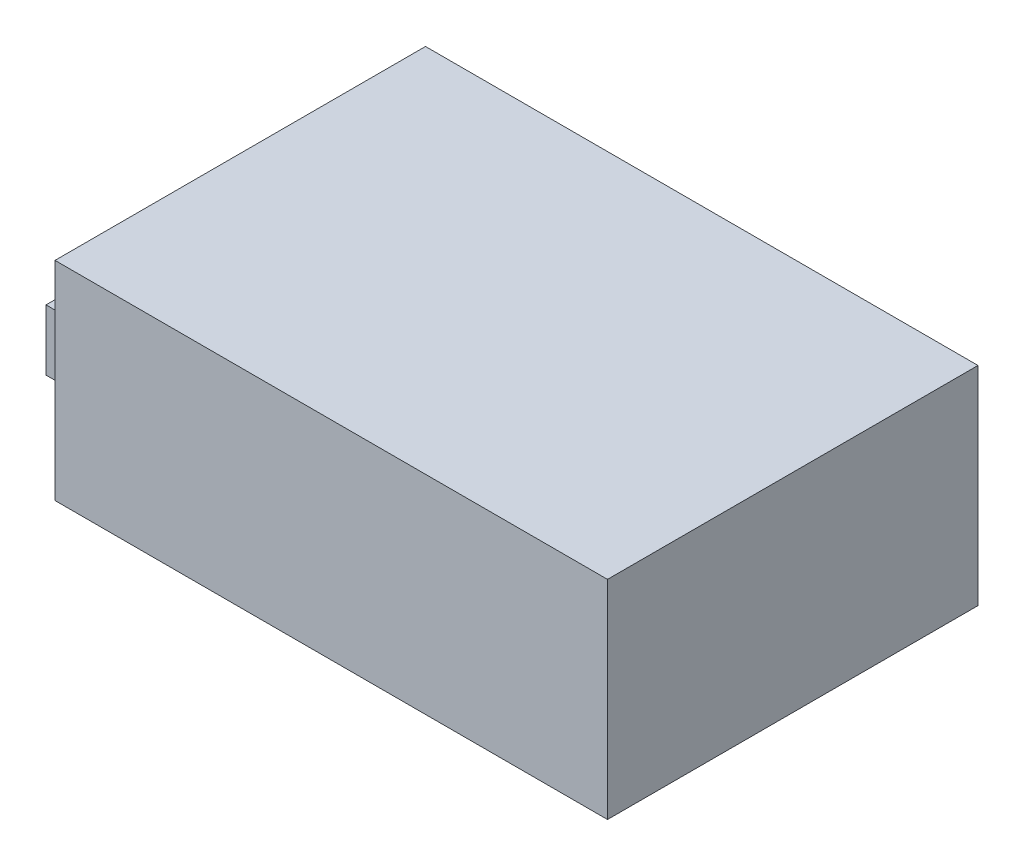
ISO-10303-21;
HEADER;
FILE_DESCRIPTION(('STEP AP214'),'2;1');
FILE_NAME('part.step','',(''),(''),'','','');
FILE_SCHEMA(('AUTOMOTIVE_DESIGN { 1 0 10303 214 1 1 1 1 }'));
ENDSEC;
DATA;
#1=APPLICATION_CONTEXT('core data for automotive mechanical design processes');
#2=APPLICATION_PROTOCOL_DEFINITION('international standard','automotive_design',2000,#1);
#3=PRODUCT_CONTEXT('',#1,'mechanical');
#4=PRODUCT('Part','Part','',(#3));
#5=PRODUCT_RELATED_PRODUCT_CATEGORY('part','',(#4));
#6=PRODUCT_DEFINITION_FORMATION('','',#4);
#7=PRODUCT_DEFINITION_CONTEXT('part definition',#1,'design');
#8=PRODUCT_DEFINITION('design','',#6,#7);
#9=PRODUCT_DEFINITION_SHAPE('','',#8);
#10=(LENGTH_UNIT() NAMED_UNIT(*) SI_UNIT(.MILLI.,.METRE.));
#11=(NAMED_UNIT(*) PLANE_ANGLE_UNIT() SI_UNIT($,.RADIAN.));
#12=(NAMED_UNIT(*) SI_UNIT($,.STERADIAN.) SOLID_ANGLE_UNIT());
#13=UNCERTAINTY_MEASURE_WITH_UNIT(LENGTH_MEASURE(1.E-05),#10,'distance_accuracy_value','');
#14=(GEOMETRIC_REPRESENTATION_CONTEXT(3) GLOBAL_UNCERTAINTY_ASSIGNED_CONTEXT((#13)) GLOBAL_UNIT_ASSIGNED_CONTEXT((#10,
#11,#12)) REPRESENTATION_CONTEXT('',''));
#15=CARTESIAN_POINT('',(0.,0.,0.));
#16=DIRECTION('',(0.,0.,1.));
#17=DIRECTION('',(1.,0.,0.));
#18=AXIS2_PLACEMENT_3D('',#15,#16,#17);
#19=CARTESIAN_POINT('',(-42.5,32.,28.5));
#20=DIRECTION('',(1.,0.,0.));
#21=DIRECTION('',(0.,0.,-1.));
#22=AXIS2_PLACEMENT_3D('',#19,#20,#21);
#23=PLANE('',#22);
#24=DIRECTION('',(0.,0.,1.));
#25=VECTOR('',#24,1.);
#26=CARTESIAN_POINT('',(-42.5,0.,28.5));
#27=LINE('',#26,#25);
#28=CARTESIAN_POINT('',(-42.5,0.,-28.5));
#29=VERTEX_POINT('',#28);
#30=CARTESIAN_POINT('',(-42.5,0.,28.5));
#31=VERTEX_POINT('',#30);
#32=EDGE_CURVE('E120',#29,#31,#27,.T.);
#33=ORIENTED_EDGE('',*,*,#32,.T.);
#34=DIRECTION('',(0.,-1.,0.));
#35=VECTOR('',#34,1.);
#36=CARTESIAN_POINT('',(-42.5,32.,28.5));
#37=LINE('',#36,#35);
#38=CARTESIAN_POINT('',(-42.5,32.,28.5));
#39=VERTEX_POINT('',#38);
#40=EDGE_CURVE('E11',#39,#31,#37,.T.);
#41=ORIENTED_EDGE('',*,*,#40,.F.);
#42=DIRECTION('',(0.,0.,1.));
#43=VECTOR('',#42,1.);
#44=CARTESIAN_POINT('',(-42.5,32.,28.5));
#45=LINE('',#44,#43);
#46=CARTESIAN_POINT('',(-42.5,32.,-28.5));
#47=VERTEX_POINT('',#46);
#48=EDGE_CURVE('E129',#47,#39,#45,.T.);
#49=ORIENTED_EDGE('',*,*,#48,.F.);
#50=DIRECTION('',(0.,-1.,0.));
#51=VECTOR('',#50,1.);
#52=CARTESIAN_POINT('',(-42.5,32.,-28.5));
#53=LINE('',#52,#51);
#54=EDGE_CURVE('E138',#47,#29,#53,.T.);
#55=ORIENTED_EDGE('',*,*,#54,.T.);
#56=EDGE_LOOP('',(#33,#41,#49,#55));
#57=FACE_BOUND('',#56,.T.);
#58=DIRECTION('',(0.,-1.,0.));
#59=VECTOR('',#58,1.);
#60=CARTESIAN_POINT('',(-42.5,3.40163827483973,-20.6707501637126));
#61=LINE('',#60,#59);
#62=CARTESIAN_POINT('',(-42.5,12.7639627764704,-20.6707501637126));
#63=VERTEX_POINT('',#62);
#64=CARTESIAN_POINT('',(-42.5,3.40163827483973,-20.6707501637126));
#65=VERTEX_POINT('',#64);
#66=EDGE_CURVE('E119',#63,#65,#61,.T.);
#67=ORIENTED_EDGE('',*,*,#66,.F.);
#68=DIRECTION('',(0.,0.,-1.));
#69=VECTOR('',#68,1.);
#70=CARTESIAN_POINT('',(-42.5,12.7639627764704,-20.6707501637126));
#71=LINE('',#70,#69);
#72=CARTESIAN_POINT('',(-42.5,12.7639627764704,15.8843932555756));
#73=VERTEX_POINT('',#72);
#74=EDGE_CURVE('E116',#73,#63,#71,.T.);
#75=ORIENTED_EDGE('',*,*,#74,.F.);
#76=DIRECTION('',(0.,1.,0.));
#77=VECTOR('',#76,1.);
#78=CARTESIAN_POINT('',(-42.5,3.40163827483973,15.8843932555756));
#79=LINE('',#78,#77);
#80=CARTESIAN_POINT('',(-42.5,3.40163827483974,15.8843932555756));
#81=VERTEX_POINT('',#80);
#82=EDGE_CURVE('E54',#81,#73,#79,.T.);
#83=ORIENTED_EDGE('',*,*,#82,.F.);
#84=DIRECTION('',(0.,0.,1.));
#85=VECTOR('',#84,1.);
#86=CARTESIAN_POINT('',(-42.5,3.40163827483973,-20.6707501637126));
#87=LINE('',#86,#85);
#88=EDGE_CURVE('E49',#65,#81,#87,.T.);
#89=ORIENTED_EDGE('',*,*,#88,.F.);
#90=EDGE_LOOP('',(#67,#75,#83,#89));
#91=FACE_BOUND('',#90,.T.);
#92=ADVANCED_FACE('F35',(#57,#91),#23,.F.);
#93=CARTESIAN_POINT('',(42.5,32.,28.5));
#94=DIRECTION('',(0.,0.,-1.));
#95=DIRECTION('',(-1.,0.,0.));
#96=AXIS2_PLACEMENT_3D('',#93,#94,#95);
#97=PLANE('',#96);
#98=DIRECTION('',(1.,0.,0.));
#99=VECTOR('',#98,1.);
#100=CARTESIAN_POINT('',(42.5,0.,28.5));
#101=LINE('',#100,#99);
#102=CARTESIAN_POINT('',(42.5,0.,28.5));
#103=VERTEX_POINT('',#102);
#104=EDGE_CURVE('E123',#31,#103,#101,.T.);
#105=ORIENTED_EDGE('',*,*,#104,.T.);
#106=DIRECTION('',(0.,-1.,0.));
#107=VECTOR('',#106,1.);
#108=CARTESIAN_POINT('',(42.5,32.,28.5));
#109=LINE('',#108,#107);
#110=CARTESIAN_POINT('',(42.5,32.,28.5));
#111=VERTEX_POINT('',#110);
#112=EDGE_CURVE('E42',#111,#103,#109,.T.);
#113=ORIENTED_EDGE('',*,*,#112,.F.);
#114=DIRECTION('',(1.,0.,0.));
#115=VECTOR('',#114,1.);
#116=CARTESIAN_POINT('',(42.5,32.,28.5));
#117=LINE('',#116,#115);
#118=EDGE_CURVE('E132',#39,#111,#117,.T.);
#119=ORIENTED_EDGE('',*,*,#118,.F.);
#120=ORIENTED_EDGE('',*,*,#40,.T.);
#121=EDGE_LOOP('',(#105,#113,#119,#120));
#122=FACE_BOUND('',#121,.T.);
#123=ADVANCED_FACE('F169',(#122),#97,.F.);
#124=CARTESIAN_POINT('',(42.5,32.,28.5));
#125=DIRECTION('',(-1.,0.,0.));
#126=DIRECTION('',(0.,0.,1.));
#127=AXIS2_PLACEMENT_3D('',#124,#125,#126);
#128=PLANE('',#127);
#129=DIRECTION('',(0.,0.,-1.));
#130=VECTOR('',#129,1.);
#131=CARTESIAN_POINT('',(42.5,0.,28.5));
#132=LINE('',#131,#130);
#133=CARTESIAN_POINT('',(42.5,0.,-28.5));
#134=VERTEX_POINT('',#133);
#135=EDGE_CURVE('E141',#103,#134,#132,.T.);
#136=ORIENTED_EDGE('',*,*,#135,.T.);
#137=DIRECTION('',(0.,-1.,0.));
#138=VECTOR('',#137,1.);
#139=CARTESIAN_POINT('',(42.5,32.,-28.5));
#140=LINE('',#139,#138);
#141=CARTESIAN_POINT('',(42.5,32.,-28.5));
#142=VERTEX_POINT('',#141);
#143=EDGE_CURVE('E146',#142,#134,#140,.T.);
#144=ORIENTED_EDGE('',*,*,#143,.F.);
#145=DIRECTION('',(0.,0.,-1.));
#146=VECTOR('',#145,1.);
#147=CARTESIAN_POINT('',(42.5,32.,28.5));
#148=LINE('',#147,#146);
#149=EDGE_CURVE('E135',#111,#142,#148,.T.);
#150=ORIENTED_EDGE('',*,*,#149,.F.);
#151=ORIENTED_EDGE('',*,*,#112,.T.);
#152=EDGE_LOOP('',(#136,#144,#150,#151));
#153=FACE_BOUND('',#152,.T.);
#154=ADVANCED_FACE('F153',(#153),#128,.F.);
#155=CARTESIAN_POINT('',(42.5,32.,-28.5));
#156=DIRECTION('',(0.,0.,1.));
#157=DIRECTION('',(1.,0.,0.));
#158=AXIS2_PLACEMENT_3D('',#155,#156,#157);
#159=PLANE('',#158);
#160=DIRECTION('',(-1.,0.,0.));
#161=VECTOR('',#160,1.);
#162=CARTESIAN_POINT('',(42.5,0.,-28.5));
#163=LINE('',#162,#161);
#164=EDGE_CURVE('E133',#134,#29,#163,.T.);
#165=ORIENTED_EDGE('',*,*,#164,.T.);
#166=ORIENTED_EDGE('',*,*,#54,.F.);
#167=DIRECTION('',(-1.,0.,0.));
#168=VECTOR('',#167,1.);
#169=CARTESIAN_POINT('',(42.5,32.,-28.5));
#170=LINE('',#169,#168);
#171=EDGE_CURVE('E137',#142,#47,#170,.T.);
#172=ORIENTED_EDGE('',*,*,#171,.F.);
#173=ORIENTED_EDGE('',*,*,#143,.T.);
#174=EDGE_LOOP('',(#165,#166,#172,#173));
#175=FACE_BOUND('',#174,.T.);
#176=ADVANCED_FACE('F162',(#175),#159,.F.);
#177=CARTESIAN_POINT('',(0.,32.,0.));
#178=DIRECTION('',(0.,1.,0.));
#179=DIRECTION('',(0.,0.,1.));
#180=AXIS2_PLACEMENT_3D('',#177,#178,#179);
#181=PLANE('',#180);
#182=ORIENTED_EDGE('',*,*,#48,.T.);
#183=ORIENTED_EDGE('',*,*,#118,.T.);
#184=ORIENTED_EDGE('',*,*,#149,.T.);
#185=ORIENTED_EDGE('',*,*,#171,.T.);
#186=EDGE_LOOP('',(#182,#183,#184,#185));
#187=FACE_BOUND('',#186,.T.);
#188=ADVANCED_FACE('F168',(#187),#181,.T.);
#189=CARTESIAN_POINT('',(0.,0.,0.));
#190=DIRECTION('',(0.,1.,0.));
#191=DIRECTION('',(0.,0.,1.));
#192=AXIS2_PLACEMENT_3D('',#189,#190,#191);
#193=PLANE('',#192);
#194=ORIENTED_EDGE('',*,*,#32,.F.);
#195=ORIENTED_EDGE('',*,*,#164,.F.);
#196=ORIENTED_EDGE('',*,*,#135,.F.);
#197=ORIENTED_EDGE('',*,*,#104,.F.);
#198=EDGE_LOOP('',(#194,#195,#196,#197));
#199=FACE_BOUND('',#198,.T.);
#200=ADVANCED_FACE('F159',(#199),#193,.F.);
#201=CARTESIAN_POINT('',(-56.5,3.40163827483973,-20.6707501637126));
#202=DIRECTION('',(0.,0.,1.));
#203=DIRECTION('',(1.,0.,0.));
#204=AXIS2_PLACEMENT_3D('',#201,#202,#203);
#205=PLANE('',#204);
#206=ORIENTED_EDGE('',*,*,#66,.T.);
#207=DIRECTION('',(1.,0.,0.));
#208=VECTOR('',#207,1.);
#209=CARTESIAN_POINT('',(-56.5,3.40163827483973,-20.6707501637126));
#210=LINE('',#209,#208);
#211=CARTESIAN_POINT('',(-56.5,3.40163827483973,-20.6707501637126));
#212=VERTEX_POINT('',#211);
#213=EDGE_CURVE('E100',#212,#65,#210,.T.);
#214=ORIENTED_EDGE('',*,*,#213,.F.);
#215=DIRECTION('',(0.,-1.,0.));
#216=VECTOR('',#215,1.);
#217=CARTESIAN_POINT('',(-56.5,3.40163827483973,-20.6707501637126));
#218=LINE('',#217,#216);
#219=CARTESIAN_POINT('',(-56.5,12.7639627764704,-20.6707501637126));
#220=VERTEX_POINT('',#219);
#221=EDGE_CURVE('E107',#220,#212,#218,.T.);
#222=ORIENTED_EDGE('',*,*,#221,.F.);
#223=DIRECTION('',(1.,0.,0.));
#224=VECTOR('',#223,1.);
#225=CARTESIAN_POINT('',(-56.5,12.7639627764704,-20.6707501637126));
#226=LINE('',#225,#224);
#227=EDGE_CURVE('E262',#220,#63,#226,.T.);
#228=ORIENTED_EDGE('',*,*,#227,.T.);
#229=EDGE_LOOP('',(#206,#214,#222,#228));
#230=FACE_BOUND('',#229,.T.);
#231=ADVANCED_FACE('F118',(#230),#205,.F.);
#232=CARTESIAN_POINT('',(-56.5,3.40163827483973,-20.6707501637126));
#233=DIRECTION('',(0.,1.,0.));
#234=DIRECTION('',(0.,0.,1.));
#235=AXIS2_PLACEMENT_3D('',#232,#233,#234);
#236=PLANE('',#235);
#237=ORIENTED_EDGE('',*,*,#88,.T.);
#238=DIRECTION('',(1.,0.,0.));
#239=VECTOR('',#238,1.);
#240=CARTESIAN_POINT('',(-56.5,3.40163827483973,15.8843932555756));
#241=LINE('',#240,#239);
#242=CARTESIAN_POINT('',(-56.5,3.40163827483973,15.8843932555756));
#243=VERTEX_POINT('',#242);
#244=EDGE_CURVE('E103',#243,#81,#241,.T.);
#245=ORIENTED_EDGE('',*,*,#244,.F.);
#246=DIRECTION('',(0.,0.,1.));
#247=VECTOR('',#246,1.);
#248=CARTESIAN_POINT('',(-56.5,3.40163827483973,-20.6707501637126));
#249=LINE('',#248,#247);
#250=EDGE_CURVE('E96',#212,#243,#249,.T.);
#251=ORIENTED_EDGE('',*,*,#250,.F.);
#252=ORIENTED_EDGE('',*,*,#213,.T.);
#253=EDGE_LOOP('',(#237,#245,#251,#252));
#254=FACE_BOUND('',#253,.T.);
#255=ADVANCED_FACE('F98',(#254),#236,.F.);
#256=CARTESIAN_POINT('',(-56.5,3.40163827483973,15.8843932555756));
#257=DIRECTION('',(0.,0.,-1.));
#258=DIRECTION('',(-1.,0.,0.));
#259=AXIS2_PLACEMENT_3D('',#256,#257,#258);
#260=PLANE('',#259);
#261=ORIENTED_EDGE('',*,*,#82,.T.);
#262=DIRECTION('',(1.,0.,0.));
#263=VECTOR('',#262,1.);
#264=CARTESIAN_POINT('',(-56.5,12.7639627764704,15.8843932555756));
#265=LINE('',#264,#263);
#266=CARTESIAN_POINT('',(-56.5,12.7639627764704,15.8843932555756));
#267=VERTEX_POINT('',#266);
#268=EDGE_CURVE('E125',#267,#73,#265,.T.);
#269=ORIENTED_EDGE('',*,*,#268,.F.);
#270=DIRECTION('',(0.,1.,0.));
#271=VECTOR('',#270,1.);
#272=CARTESIAN_POINT('',(-56.5,3.40163827483973,15.8843932555756));
#273=LINE('',#272,#271);
#274=EDGE_CURVE('E106',#243,#267,#273,.T.);
#275=ORIENTED_EDGE('',*,*,#274,.F.);
#276=ORIENTED_EDGE('',*,*,#244,.T.);
#277=EDGE_LOOP('',(#261,#269,#275,#276));
#278=FACE_BOUND('',#277,.T.);
#279=ADVANCED_FACE('F187',(#278),#260,.F.);
#280=CARTESIAN_POINT('',(-56.5,12.7639627764704,-20.6707501637126));
#281=DIRECTION('',(0.,-1.,0.));
#282=DIRECTION('',(0.,0.,-1.));
#283=AXIS2_PLACEMENT_3D('',#280,#281,#282);
#284=PLANE('',#283);
#285=ORIENTED_EDGE('',*,*,#74,.T.);
#286=ORIENTED_EDGE('',*,*,#227,.F.);
#287=DIRECTION('',(0.,0.,-1.));
#288=VECTOR('',#287,1.);
#289=CARTESIAN_POINT('',(-56.5,12.7639627764704,-20.6707501637126));
#290=LINE('',#289,#288);
#291=EDGE_CURVE('E112',#267,#220,#290,.T.);
#292=ORIENTED_EDGE('',*,*,#291,.F.);
#293=ORIENTED_EDGE('',*,*,#268,.T.);
#294=EDGE_LOOP('',(#285,#286,#292,#293));
#295=FACE_BOUND('',#294,.T.);
#296=ADVANCED_FACE('F190',(#295),#284,.F.);
#297=CARTESIAN_POINT('',(-56.5,0.,0.));
#298=DIRECTION('',(1.,0.,0.));
#299=DIRECTION('',(0.,0.,-1.));
#300=AXIS2_PLACEMENT_3D('',#297,#298,#299);
#301=PLANE('',#300);
#302=ORIENTED_EDGE('',*,*,#221,.T.);
#303=ORIENTED_EDGE('',*,*,#250,.T.);
#304=ORIENTED_EDGE('',*,*,#274,.T.);
#305=ORIENTED_EDGE('',*,*,#291,.T.);
#306=EDGE_LOOP('',(#302,#303,#304,#305));
#307=FACE_BOUND('',#306,.T.);
#308=ADVANCED_FACE('F110',(#307),#301,.F.);
#309=CLOSED_SHELL('',(#92,#123,#154,#176,#188,#200,#231,#255,#279,#296,#308));
#310=MANIFOLD_SOLID_BREP('B2',#309);
#311=ADVANCED_BREP_SHAPE_REPRESENTATION('',(#18,#310),#14);
#312=SHAPE_DEFINITION_REPRESENTATION(#9,#311);
ENDSEC;
END-ISO-10303-21;
